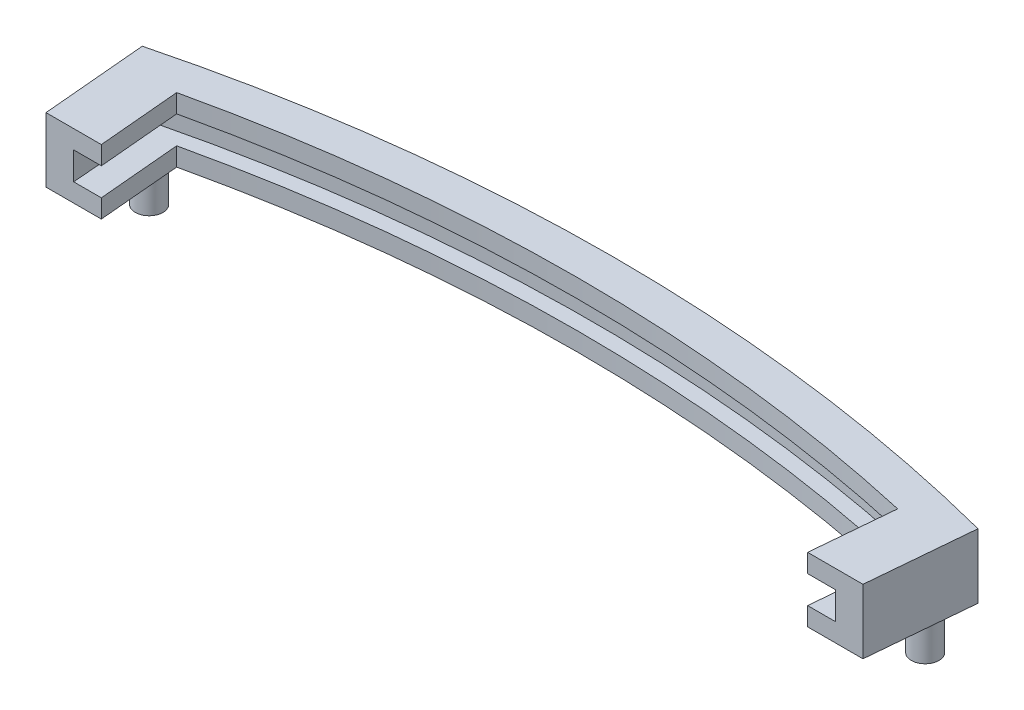
ISO-10303-21;
HEADER;
FILE_DESCRIPTION(('STEP AP214'),'2;1');
FILE_NAME('part.step','',(''),(''),'','','');
FILE_SCHEMA(('AUTOMOTIVE_DESIGN { 1 0 10303 214 1 1 1 1 }'));
ENDSEC;
DATA;
#1=APPLICATION_CONTEXT('core data for automotive mechanical design processes');
#2=APPLICATION_PROTOCOL_DEFINITION('international standard','automotive_design',2000,#1);
#3=PRODUCT_CONTEXT('',#1,'mechanical');
#4=PRODUCT('Part','Part','',(#3));
#5=PRODUCT_RELATED_PRODUCT_CATEGORY('part','',(#4));
#6=PRODUCT_DEFINITION_FORMATION('','',#4);
#7=PRODUCT_DEFINITION_CONTEXT('part definition',#1,'design');
#8=PRODUCT_DEFINITION('design','',#6,#7);
#9=PRODUCT_DEFINITION_SHAPE('','',#8);
#10=(LENGTH_UNIT() NAMED_UNIT(*) SI_UNIT(.MILLI.,.METRE.));
#11=(NAMED_UNIT(*) PLANE_ANGLE_UNIT() SI_UNIT($,.RADIAN.));
#12=(NAMED_UNIT(*) SI_UNIT($,.STERADIAN.) SOLID_ANGLE_UNIT());
#13=UNCERTAINTY_MEASURE_WITH_UNIT(LENGTH_MEASURE(1.E-05),#10,'distance_accuracy_value','');
#14=(GEOMETRIC_REPRESENTATION_CONTEXT(3) GLOBAL_UNCERTAINTY_ASSIGNED_CONTEXT((#13)) GLOBAL_UNIT_ASSIGNED_CONTEXT((#10,
#11,#12)) REPRESENTATION_CONTEXT('',''));
#15=CARTESIAN_POINT('',(0.,0.,0.));
#16=DIRECTION('',(0.,0.,1.));
#17=DIRECTION('',(1.,0.,0.));
#18=AXIS2_PLACEMENT_3D('',#15,#16,#17);
#19=CARTESIAN_POINT('',(0.,0.,0.));
#20=DIRECTION('',(0.,1.,0.));
#21=DIRECTION('',(0.,0.,1.));
#22=AXIS2_PLACEMENT_3D('',#19,#20,#21);
#23=PLANE('',#22);
#24=CARTESIAN_POINT('',(42.0723413631206,0.,-172.963740324371));
#25=DIRECTION('',(0.,1.,0.));
#26=DIRECTION('',(0.,0.,1.));
#27=AXIS2_PLACEMENT_3D('',#24,#25,#26);
#28=CIRCLE('',#27,1.5);
#29=CARTESIAN_POINT('',(42.0723413631206,0.,-171.463740324371));
#30=VERTEX_POINT('',#29);
#31=EDGE_CURVE('E557',#30,#30,#28,.T.);
#32=ORIENTED_EDGE('',*,*,#31,.T.);
#33=EDGE_LOOP('',(#32));
#34=FACE_BOUND('',#33,.T.);
#35=DIRECTION('',(0.0885466075362224,0.,-0.996072034691179));
#36=VECTOR('',#35,1.);
#37=CARTESIAN_POINT('',(38.2925339246378,0.,-163.99909201215));
#38=LINE('',#37,#36);
#39=CARTESIAN_POINT('',(38.2925339246378,0.,-163.99909201215));
#40=VERTEX_POINT('',#39);
#41=CARTESIAN_POINT('',(39.0894533924638,0.,-172.963740324371));
#42=VERTEX_POINT('',#41);
#43=EDGE_CURVE('E275',#40,#42,#38,.T.);
#44=ORIENTED_EDGE('',*,*,#43,.T.);
#45=CARTESIAN_POINT('',(0.,0.,0.));
#46=DIRECTION('',(0.,1.,0.));
#47=DIRECTION('',(0.,0.,1.));
#48=AXIS2_PLACEMENT_3D('',#45,#46,#47);
#49=CIRCLE('',#48,177.325804195323);
#50=CARTESIAN_POINT('',(-39.0894533924644,0.,-172.963740324371));
#51=VERTEX_POINT('',#50);
#52=EDGE_CURVE('E298',#42,#51,#49,.T.);
#53=ORIENTED_EDGE('',*,*,#52,.T.);
#54=DIRECTION('',(-0.0885466075362231,0.,-0.996072034691179));
#55=VECTOR('',#54,1.);
#56=CARTESIAN_POINT('',(-38.2925339246385,0.,-163.99909201215));
#57=LINE('',#56,#55);
#58=CARTESIAN_POINT('',(-38.2925339246385,0.,-163.99909201215));
#59=VERTEX_POINT('',#58);
#60=EDGE_CURVE('E302',#59,#51,#57,.T.);
#61=ORIENTED_EDGE('',*,*,#60,.F.);
#62=DIRECTION('',(1.,0.,0.));
#63=VECTOR('',#62,1.);
#64=CARTESIAN_POINT('',(-44.2925339246385,0.,-163.99909201215));
#65=LINE('',#64,#63);
#66=CARTESIAN_POINT('',(-44.2925339246385,0.,-163.99909201215));
#67=VERTEX_POINT('',#66);
#68=EDGE_CURVE('E306',#67,#59,#65,.T.);
#69=ORIENTED_EDGE('',*,*,#68,.F.);
#70=DIRECTION('',(-0.0885466075362229,0.,-0.996072034691179));
#71=VECTOR('',#70,1.);
#72=CARTESIAN_POINT('',(-44.2925339246385,0.,-163.99909201215));
#73=LINE('',#72,#71);
#74=CARTESIAN_POINT('',(-45.310819911305,0.,-175.453920411099));
#75=VERTEX_POINT('',#74);
#76=EDGE_CURVE('E164',#67,#75,#73,.T.);
#77=ORIENTED_EDGE('',*,*,#76,.T.);
#78=CARTESIAN_POINT('',(0.,0.,0.));
#79=DIRECTION('',(0.,1.,0.));
#80=DIRECTION('',(0.,0.,1.));
#81=AXIS2_PLACEMENT_3D('',#78,#79,#80);
#82=CIRCLE('',#81,181.21023312346);
#83=CARTESIAN_POINT('',(45.3108199113043,0.,-175.453920411099));
#84=VERTEX_POINT('',#83);
#85=EDGE_CURVE('E311',#84,#75,#82,.T.);
#86=ORIENTED_EDGE('',*,*,#85,.F.);
#87=DIRECTION('',(0.0885466075362233,0.,-0.996072034691179));
#88=VECTOR('',#87,1.);
#89=CARTESIAN_POINT('',(44.2925339246378,0.,-163.99909201215));
#90=LINE('',#89,#88);
#91=CARTESIAN_POINT('',(44.2925339246378,0.,-163.99909201215));
#92=VERTEX_POINT('',#91);
#93=EDGE_CURVE('E315',#92,#84,#90,.T.);
#94=ORIENTED_EDGE('',*,*,#93,.F.);
#95=DIRECTION('',(1.,0.,0.));
#96=VECTOR('',#95,1.);
#97=CARTESIAN_POINT('',(38.2925339246378,0.,-163.99909201215));
#98=LINE('',#97,#96);
#99=EDGE_CURVE('E281',#40,#92,#98,.T.);
#100=ORIENTED_EDGE('',*,*,#99,.F.);
#101=EDGE_LOOP('',(#44,#53,#61,#69,#77,#86,#94,#100));
#102=FACE_BOUND('',#101,.T.);
#103=CARTESIAN_POINT('',(-42.0723413631214,0.,-172.963740324371));
#104=DIRECTION('',(0.,1.,0.));
#105=DIRECTION('',(0.,0.,1.));
#106=AXIS2_PLACEMENT_3D('',#103,#104,#105);
#107=CIRCLE('',#106,1.5);
#108=CARTESIAN_POINT('',(-42.0723413631214,0.,-171.463740324371));
#109=VERTEX_POINT('',#108);
#110=EDGE_CURVE('E11',#109,#109,#107,.F.);
#111=ORIENTED_EDGE('',*,*,#110,.F.);
#112=EDGE_LOOP('',(#111));
#113=FACE_BOUND('',#112,.T.);
#114=ADVANCED_FACE('F45',(#34,#102,#113),#23,.F.);
#115=CARTESIAN_POINT('',(38.2925339246378,2.,-163.99909201215));
#116=DIRECTION('',(-0.99607203469118,0.,-0.0885466075362224));
#117=DIRECTION('',(-0.0885466075362224,0.,0.99607203469118));
#118=AXIS2_PLACEMENT_3D('',#115,#116,#117);
#119=PLANE('',#118);
#120=ORIENTED_EDGE('',*,*,#43,.F.);
#121=DIRECTION('',(0.,-1.,0.));
#122=VECTOR('',#121,1.);
#123=CARTESIAN_POINT('',(38.2925339246378,2.,-163.99909201215));
#124=LINE('',#123,#122);
#125=CARTESIAN_POINT('',(38.2925339246378,2.,-163.99909201215));
#126=VERTEX_POINT('',#125);
#127=EDGE_CURVE('E54',#126,#40,#124,.T.);
#128=ORIENTED_EDGE('',*,*,#127,.F.);
#129=DIRECTION('',(0.0885466075362224,0.,-0.996072034691179));
#130=VECTOR('',#129,1.);
#131=CARTESIAN_POINT('',(38.2925339246378,2.,-163.99909201215));
#132=LINE('',#131,#130);
#133=CARTESIAN_POINT('',(39.0894533924638,2.,-172.963740324371));
#134=VERTEX_POINT('',#133);
#135=EDGE_CURVE('E276',#126,#134,#132,.T.);
#136=ORIENTED_EDGE('',*,*,#135,.T.);
#137=DIRECTION('',(0.,-1.,0.));
#138=VECTOR('',#137,1.);
#139=CARTESIAN_POINT('',(39.0894533924638,2.,-172.963740324371));
#140=LINE('',#139,#138);
#141=EDGE_CURVE('E294',#134,#42,#140,.T.);
#142=ORIENTED_EDGE('',*,*,#141,.T.);
#143=EDGE_LOOP('',(#120,#128,#136,#142));
#144=FACE_BOUND('',#143,.T.);
#145=ADVANCED_FACE('F47',(#144),#119,.T.);
#146=CARTESIAN_POINT('',(38.2925339246378,2.,-163.99909201215));
#147=DIRECTION('',(0.,0.,-1.));
#148=DIRECTION('',(-1.,0.,0.));
#149=AXIS2_PLACEMENT_3D('',#146,#147,#148);
#150=PLANE('',#149);
#151=ORIENTED_EDGE('',*,*,#99,.T.);
#152=DIRECTION('',(0.,-1.,0.));
#153=VECTOR('',#152,1.);
#154=CARTESIAN_POINT('',(44.2925339246378,2.,-163.99909201215));
#155=LINE('',#154,#153);
#156=CARTESIAN_POINT('',(44.2925339246378,7.,-163.99909201215));
#157=VERTEX_POINT('',#156);
#158=EDGE_CURVE('E322',#157,#92,#155,.T.);
#159=ORIENTED_EDGE('',*,*,#158,.F.);
#160=DIRECTION('',(1.,0.,0.));
#161=VECTOR('',#160,1.);
#162=CARTESIAN_POINT('',(38.2925339246378,7.,-163.99909201215));
#163=LINE('',#162,#161);
#164=CARTESIAN_POINT('',(38.2925339246378,7.,-163.99909201215));
#165=VERTEX_POINT('',#164);
#166=EDGE_CURVE('E205',#165,#157,#163,.T.);
#167=ORIENTED_EDGE('',*,*,#166,.F.);
#168=DIRECTION('',(0.,-1.,0.));
#169=VECTOR('',#168,1.);
#170=CARTESIAN_POINT('',(38.2925339246378,7.,-163.99909201215));
#171=LINE('',#170,#169);
#172=CARTESIAN_POINT('',(38.2925339246378,5.,-163.99909201215));
#173=VERTEX_POINT('',#172);
#174=EDGE_CURVE('E214',#165,#173,#171,.T.);
#175=ORIENTED_EDGE('',*,*,#174,.T.);
#176=DIRECTION('',(1.,0.,0.));
#177=VECTOR('',#176,1.);
#178=CARTESIAN_POINT('',(38.2925339246378,5.,-163.99909201215));
#179=LINE('',#178,#177);
#180=CARTESIAN_POINT('',(41.2925339246378,5.,-163.99909201215));
#181=VERTEX_POINT('',#180);
#182=EDGE_CURVE('E187',#173,#181,#179,.T.);
#183=ORIENTED_EDGE('',*,*,#182,.T.);
#184=DIRECTION('',(0.,-1.,0.));
#185=VECTOR('',#184,1.);
#186=CARTESIAN_POINT('',(41.2925339246378,5.,-163.99909201215));
#187=LINE('',#186,#185);
#188=CARTESIAN_POINT('',(41.2925339246378,2.,-163.99909201215));
#189=VERTEX_POINT('',#188);
#190=EDGE_CURVE('E252',#181,#189,#187,.T.);
#191=ORIENTED_EDGE('',*,*,#190,.T.);
#192=DIRECTION('',(1.,0.,0.));
#193=VECTOR('',#192,1.);
#194=CARTESIAN_POINT('',(38.2925339246378,2.,-163.99909201215));
#195=LINE('',#194,#193);
#196=EDGE_CURVE('E291',#126,#189,#195,.T.);
#197=ORIENTED_EDGE('',*,*,#196,.F.);
#198=ORIENTED_EDGE('',*,*,#127,.T.);
#199=EDGE_LOOP('',(#151,#159,#167,#175,#183,#191,#197,#198));
#200=FACE_BOUND('',#199,.T.);
#201=ADVANCED_FACE('F353',(#200),#150,.F.);
#202=CARTESIAN_POINT('',(44.2925339246378,2.,-163.99909201215));
#203=DIRECTION('',(-0.996072034691179,0.,-0.0885466075362233));
#204=DIRECTION('',(-0.0885466075362233,0.,0.996072034691179));
#205=AXIS2_PLACEMENT_3D('',#202,#203,#204);
#206=PLANE('',#205);
#207=ORIENTED_EDGE('',*,*,#93,.T.);
#208=DIRECTION('',(0.,-1.,0.));
#209=VECTOR('',#208,1.);
#210=CARTESIAN_POINT('',(45.3108199113043,2.,-175.453920411099));
#211=LINE('',#210,#209);
#212=CARTESIAN_POINT('',(45.3108199113043,7.,-175.453920411099));
#213=VERTEX_POINT('',#212);
#214=EDGE_CURVE('E326',#213,#84,#211,.T.);
#215=ORIENTED_EDGE('',*,*,#214,.F.);
#216=DIRECTION('',(0.0885466075362233,0.,-0.996072034691179));
#217=VECTOR('',#216,1.);
#218=CARTESIAN_POINT('',(44.2925339246378,7.,-163.99909201215));
#219=LINE('',#218,#217);
#220=EDGE_CURVE('E209',#157,#213,#219,.T.);
#221=ORIENTED_EDGE('',*,*,#220,.F.);
#222=ORIENTED_EDGE('',*,*,#158,.T.);
#223=EDGE_LOOP('',(#207,#215,#221,#222));
#224=FACE_BOUND('',#223,.T.);
#225=ADVANCED_FACE('F358',(#224),#206,.F.);
#226=CARTESIAN_POINT('',(0.,2.,0.));
#227=DIRECTION('',(0.,-1.,0.));
#228=DIRECTION('',(0.,0.,-1.));
#229=AXIS2_PLACEMENT_3D('',#226,#227,#228);
#230=CYLINDRICAL_SURFACE('',#229,181.21023312346);
#231=ORIENTED_EDGE('',*,*,#85,.T.);
#232=DIRECTION('',(0.,-1.,0.));
#233=VECTOR('',#232,1.);
#234=CARTESIAN_POINT('',(-45.310819911305,2.,-175.453920411099));
#235=LINE('',#234,#233);
#236=CARTESIAN_POINT('',(-45.3108199113049,7.,-175.453920411098));
#237=VERTEX_POINT('',#236);
#238=EDGE_CURVE('E168',#237,#75,#235,.T.);
#239=ORIENTED_EDGE('',*,*,#238,.F.);
#240=CARTESIAN_POINT('',(0.,7.,0.));
#241=DIRECTION('',(0.,1.,0.));
#242=DIRECTION('',(0.,0.,1.));
#243=AXIS2_PLACEMENT_3D('',#240,#241,#242);
#244=CIRCLE('',#243,181.21023312346);
#245=EDGE_CURVE('E185',#213,#237,#244,.T.);
#246=ORIENTED_EDGE('',*,*,#245,.F.);
#247=ORIENTED_EDGE('',*,*,#214,.T.);
#248=EDGE_LOOP('',(#231,#239,#246,#247));
#249=FACE_BOUND('',#248,.T.);
#250=ADVANCED_FACE('F360',(#249),#230,.T.);
#251=CARTESIAN_POINT('',(-44.2925339246385,2.,-163.99909201215));
#252=DIRECTION('',(-0.996072034691179,0.,0.0885466075362229));
#253=DIRECTION('',(0.0885466075362229,0.,0.99607203469118));
#254=AXIS2_PLACEMENT_3D('',#251,#252,#253);
#255=PLANE('',#254);
#256=ORIENTED_EDGE('',*,*,#76,.F.);
#257=DIRECTION('',(0.,-1.,0.));
#258=VECTOR('',#257,1.);
#259=CARTESIAN_POINT('',(-44.2925339246385,2.,-163.99909201215));
#260=LINE('',#259,#258);
#261=CARTESIAN_POINT('',(-44.2925339246385,7.,-163.99909201215));
#262=VERTEX_POINT('',#261);
#263=EDGE_CURVE('E158',#262,#67,#260,.T.);
#264=ORIENTED_EDGE('',*,*,#263,.F.);
#265=DIRECTION('',(0.088546607536219,0.,0.99607203469118));
#266=VECTOR('',#265,1.);
#267=CARTESIAN_POINT('',(-44.2925339246385,7.,-163.99909201215));
#268=LINE('',#267,#266);
#269=EDGE_CURVE('E162',#237,#262,#268,.T.);
#270=ORIENTED_EDGE('',*,*,#269,.F.);
#271=ORIENTED_EDGE('',*,*,#238,.T.);
#272=EDGE_LOOP('',(#256,#264,#270,#271));
#273=FACE_BOUND('',#272,.T.);
#274=ADVANCED_FACE('F160',(#273),#255,.T.);
#275=CARTESIAN_POINT('',(-44.2925339246385,2.,-163.99909201215));
#276=DIRECTION('',(0.,0.,-1.));
#277=DIRECTION('',(-1.,0.,0.));
#278=AXIS2_PLACEMENT_3D('',#275,#276,#277);
#279=PLANE('',#278);
#280=ORIENTED_EDGE('',*,*,#68,.T.);
#281=DIRECTION('',(0.,-1.,0.));
#282=VECTOR('',#281,1.);
#283=CARTESIAN_POINT('',(-38.2925339246385,2.,-163.99909201215));
#284=LINE('',#283,#282);
#285=CARTESIAN_POINT('',(-38.2925339246385,2.,-163.99909201215));
#286=VERTEX_POINT('',#285);
#287=EDGE_CURVE('E169',#286,#59,#284,.T.);
#288=ORIENTED_EDGE('',*,*,#287,.F.);
#289=DIRECTION('',(1.,0.,0.));
#290=VECTOR('',#289,1.);
#291=CARTESIAN_POINT('',(-44.2925339246385,2.,-163.99909201215));
#292=LINE('',#291,#290);
#293=CARTESIAN_POINT('',(-41.2925339246385,2.,-163.99909201215));
#294=VERTEX_POINT('',#293);
#295=EDGE_CURVE('E288',#294,#286,#292,.T.);
#296=ORIENTED_EDGE('',*,*,#295,.F.);
#297=DIRECTION('',(0.,-1.,0.));
#298=VECTOR('',#297,1.);
#299=CARTESIAN_POINT('',(-41.2925339246385,5.,-163.99909201215));
#300=LINE('',#299,#298);
#301=CARTESIAN_POINT('',(-41.2925339246385,5.,-163.99909201215));
#302=VERTEX_POINT('',#301);
#303=EDGE_CURVE('E271',#302,#294,#300,.T.);
#304=ORIENTED_EDGE('',*,*,#303,.F.);
#305=DIRECTION('',(1.,0.,0.));
#306=VECTOR('',#305,1.);
#307=CARTESIAN_POINT('',(-44.2925339246385,5.,-163.99909201215));
#308=LINE('',#307,#306);
#309=CARTESIAN_POINT('',(-38.2925339246385,5.,-163.99909201215));
#310=VERTEX_POINT('',#309);
#311=EDGE_CURVE('E215',#302,#310,#308,.T.);
#312=ORIENTED_EDGE('',*,*,#311,.T.);
#313=DIRECTION('',(0.,-1.,0.));
#314=VECTOR('',#313,1.);
#315=CARTESIAN_POINT('',(-38.2925339246385,7.,-163.99909201215));
#316=LINE('',#315,#314);
#317=CARTESIAN_POINT('',(-38.2925339246385,7.,-163.99909201215));
#318=VERTEX_POINT('',#317);
#319=EDGE_CURVE('E175',#318,#310,#316,.T.);
#320=ORIENTED_EDGE('',*,*,#319,.F.);
#321=DIRECTION('',(1.,0.,0.));
#322=VECTOR('',#321,1.);
#323=CARTESIAN_POINT('',(-44.2925339246385,7.,-163.99909201215));
#324=LINE('',#323,#322);
#325=EDGE_CURVE('E172',#262,#318,#324,.T.);
#326=ORIENTED_EDGE('',*,*,#325,.F.);
#327=ORIENTED_EDGE('',*,*,#263,.T.);
#328=EDGE_LOOP('',(#280,#288,#296,#304,#312,#320,#326,#327));
#329=FACE_BOUND('',#328,.T.);
#330=ADVANCED_FACE('F173',(#329),#279,.F.);
#331=CARTESIAN_POINT('',(-38.2925339246385,2.,-163.99909201215));
#332=DIRECTION('',(-0.996072034691179,0.,0.0885466075362231));
#333=DIRECTION('',(0.0885466075362232,0.,0.99607203469118));
#334=AXIS2_PLACEMENT_3D('',#331,#332,#333);
#335=PLANE('',#334);
#336=ORIENTED_EDGE('',*,*,#60,.T.);
#337=DIRECTION('',(0.,-1.,0.));
#338=VECTOR('',#337,1.);
#339=CARTESIAN_POINT('',(-39.0894533924644,2.,-172.963740324371));
#340=LINE('',#339,#338);
#341=CARTESIAN_POINT('',(-39.0894533924644,2.,-172.963740324371));
#342=VERTEX_POINT('',#341);
#343=EDGE_CURVE('E335',#342,#51,#340,.T.);
#344=ORIENTED_EDGE('',*,*,#343,.F.);
#345=DIRECTION('',(-0.0885466075362231,0.,-0.996072034691179));
#346=VECTOR('',#345,1.);
#347=CARTESIAN_POINT('',(-38.2925339246385,2.,-163.99909201215));
#348=LINE('',#347,#346);
#349=EDGE_CURVE('E285',#286,#342,#348,.T.);
#350=ORIENTED_EDGE('',*,*,#349,.F.);
#351=ORIENTED_EDGE('',*,*,#287,.T.);
#352=EDGE_LOOP('',(#336,#344,#350,#351));
#353=FACE_BOUND('',#352,.T.);
#354=ADVANCED_FACE('F364',(#353),#335,.F.);
#355=CARTESIAN_POINT('',(0.,2.,0.));
#356=DIRECTION('',(0.,-1.,0.));
#357=DIRECTION('',(0.,0.,-1.));
#358=AXIS2_PLACEMENT_3D('',#355,#356,#357);
#359=CYLINDRICAL_SURFACE('',#358,177.325804195323);
#360=ORIENTED_EDGE('',*,*,#52,.F.);
#361=ORIENTED_EDGE('',*,*,#141,.F.);
#362=CARTESIAN_POINT('',(0.,2.,0.));
#363=DIRECTION('',(0.,1.,0.));
#364=DIRECTION('',(0.,0.,1.));
#365=AXIS2_PLACEMENT_3D('',#362,#363,#364);
#366=CIRCLE('',#365,177.325804195323);
#367=EDGE_CURVE('E280',#134,#342,#366,.T.);
#368=ORIENTED_EDGE('',*,*,#367,.T.);
#369=ORIENTED_EDGE('',*,*,#343,.T.);
#370=EDGE_LOOP('',(#360,#361,#368,#369));
#371=FACE_BOUND('',#370,.T.);
#372=ADVANCED_FACE('F344',(#371),#359,.F.);
#373=CARTESIAN_POINT('',(0.,2.,0.));
#374=DIRECTION('',(0.,1.,0.));
#375=DIRECTION('',(0.,0.,1.));
#376=AXIS2_PLACEMENT_3D('',#373,#374,#375);
#377=PLANE('',#376);
#378=DIRECTION('',(-0.0885466075362226,0.,0.996072034691179));
#379=VECTOR('',#378,1.);
#380=CARTESIAN_POINT('',(41.2925339246378,2.,-163.99909201215));
#381=LINE('',#380,#379);
#382=CARTESIAN_POINT('',(42.178,2.,-173.959812359062));
#383=VERTEX_POINT('',#382);
#384=EDGE_CURVE('E61',#383,#189,#381,.T.);
#385=ORIENTED_EDGE('',*,*,#384,.F.);
#386=CARTESIAN_POINT('',(0.,2.,0.));
#387=DIRECTION('',(0.,-1.,0.));
#388=DIRECTION('',(0.,0.,1.));
#389=AXIS2_PLACEMENT_3D('',#386,#387,#388);
#390=CIRCLE('',#389,179.);
#391=CARTESIAN_POINT('',(-42.1027354556342,2.,-173.978043635261));
#392=VERTEX_POINT('',#391);
#393=EDGE_CURVE('E255',#392,#383,#390,.T.);
#394=ORIENTED_EDGE('',*,*,#393,.F.);
#395=DIRECTION('',(-0.080924757758321,0.,-0.996720213290448));
#396=VECTOR('',#395,1.);
#397=CARTESIAN_POINT('',(-41.2925339246385,2.,-163.99909201215));
#398=LINE('',#397,#396);
#399=EDGE_CURVE('E67',#294,#392,#398,.T.);
#400=ORIENTED_EDGE('',*,*,#399,.F.);
#401=ORIENTED_EDGE('',*,*,#295,.T.);
#402=ORIENTED_EDGE('',*,*,#349,.T.);
#403=ORIENTED_EDGE('',*,*,#367,.F.);
#404=ORIENTED_EDGE('',*,*,#135,.F.);
#405=ORIENTED_EDGE('',*,*,#196,.T.);
#406=EDGE_LOOP('',(#385,#394,#400,#401,#402,#403,#404,#405));
#407=FACE_BOUND('',#406,.T.);
#408=ADVANCED_FACE('F365',(#407),#377,.T.);
#409=CARTESIAN_POINT('',(-41.2925339246385,5.,-163.99909201215));
#410=DIRECTION('',(-0.996720213290448,0.,0.0809247577583211));
#411=DIRECTION('',(0.0809247577583211,0.,0.996720213290448));
#412=AXIS2_PLACEMENT_3D('',#409,#410,#411);
#413=PLANE('',#412);
#414=ORIENTED_EDGE('',*,*,#399,.T.);
#415=DIRECTION('',(0.,-1.,0.));
#416=VECTOR('',#415,1.);
#417=CARTESIAN_POINT('',(-42.1027354556342,5.,-173.978043635261));
#418=LINE('',#417,#416);
#419=CARTESIAN_POINT('',(-42.1027354556342,5.,-173.978043635261));
#420=VERTEX_POINT('',#419);
#421=EDGE_CURVE('E267',#420,#392,#418,.T.);
#422=ORIENTED_EDGE('',*,*,#421,.F.);
#423=DIRECTION('',(-0.080924757758321,0.,-0.996720213290448));
#424=VECTOR('',#423,1.);
#425=CARTESIAN_POINT('',(-41.2925339246385,5.,-163.99909201215));
#426=LINE('',#425,#424);
#427=EDGE_CURVE('E240',#302,#420,#426,.T.);
#428=ORIENTED_EDGE('',*,*,#427,.F.);
#429=ORIENTED_EDGE('',*,*,#303,.T.);
#430=EDGE_LOOP('',(#414,#422,#428,#429));
#431=FACE_BOUND('',#430,.T.);
#432=ADVANCED_FACE('F369',(#431),#413,.F.);
#433=CARTESIAN_POINT('',(0.,5.,0.));
#434=DIRECTION('',(0.,-1.,0.));
#435=DIRECTION('',(0.,0.,-1.));
#436=AXIS2_PLACEMENT_3D('',#433,#434,#435);
#437=CYLINDRICAL_SURFACE('',#436,179.);
#438=ORIENTED_EDGE('',*,*,#393,.T.);
#439=DIRECTION('',(0.,-1.,0.));
#440=VECTOR('',#439,1.);
#441=CARTESIAN_POINT('',(42.178,5.,-173.959812359062));
#442=LINE('',#441,#440);
#443=CARTESIAN_POINT('',(42.178,5.,-173.959812359062));
#444=VERTEX_POINT('',#443);
#445=EDGE_CURVE('E263',#444,#383,#442,.T.);
#446=ORIENTED_EDGE('',*,*,#445,.F.);
#447=CARTESIAN_POINT('',(0.,5.,0.));
#448=DIRECTION('',(0.,-1.,0.));
#449=DIRECTION('',(0.,0.,1.));
#450=AXIS2_PLACEMENT_3D('',#447,#448,#449);
#451=CIRCLE('',#450,179.);
#452=EDGE_CURVE('E244',#420,#444,#451,.T.);
#453=ORIENTED_EDGE('',*,*,#452,.F.);
#454=ORIENTED_EDGE('',*,*,#421,.T.);
#455=EDGE_LOOP('',(#438,#446,#453,#454));
#456=FACE_BOUND('',#455,.T.);
#457=ADVANCED_FACE('F392',(#456),#437,.F.);
#458=CARTESIAN_POINT('',(41.2925339246378,5.,-163.99909201215));
#459=DIRECTION('',(0.996072034691179,0.,0.0885466075362226));
#460=DIRECTION('',(0.0885466075362226,0.,-0.996072034691179));
#461=AXIS2_PLACEMENT_3D('',#458,#459,#460);
#462=PLANE('',#461);
#463=ORIENTED_EDGE('',*,*,#384,.T.);
#464=ORIENTED_EDGE('',*,*,#190,.F.);
#465=DIRECTION('',(-0.0885466075362226,0.,0.996072034691179));
#466=VECTOR('',#465,1.);
#467=CARTESIAN_POINT('',(41.2925339246378,5.,-163.99909201215));
#468=LINE('',#467,#466);
#469=EDGE_CURVE('E248',#444,#181,#468,.T.);
#470=ORIENTED_EDGE('',*,*,#469,.F.);
#471=ORIENTED_EDGE('',*,*,#445,.T.);
#472=EDGE_LOOP('',(#463,#464,#470,#471));
#473=FACE_BOUND('',#472,.T.);
#474=ADVANCED_FACE('F390',(#473),#462,.F.);
#475=CARTESIAN_POINT('',(0.,5.,0.));
#476=DIRECTION('',(0.,1.,0.));
#477=DIRECTION('',(0.,0.,1.));
#478=AXIS2_PLACEMENT_3D('',#475,#476,#477);
#479=PLANE('',#478);
#480=ORIENTED_EDGE('',*,*,#311,.F.);
#481=ORIENTED_EDGE('',*,*,#427,.T.);
#482=ORIENTED_EDGE('',*,*,#452,.T.);
#483=ORIENTED_EDGE('',*,*,#469,.T.);
#484=ORIENTED_EDGE('',*,*,#182,.F.);
#485=DIRECTION('',(-0.0885466075362224,0.,0.996072034691179));
#486=VECTOR('',#485,1.);
#487=CARTESIAN_POINT('',(39.0894533924638,5.,-172.963740324371));
#488=LINE('',#487,#486);
#489=CARTESIAN_POINT('',(39.0894533924638,5.,-172.963740324371));
#490=VERTEX_POINT('',#489);
#491=EDGE_CURVE('E191',#490,#173,#488,.T.);
#492=ORIENTED_EDGE('',*,*,#491,.F.);
#493=CARTESIAN_POINT('',(0.,5.,0.));
#494=DIRECTION('',(0.,-1.,0.));
#495=DIRECTION('',(0.,0.,1.));
#496=AXIS2_PLACEMENT_3D('',#493,#494,#495);
#497=CIRCLE('',#496,177.325804195323);
#498=CARTESIAN_POINT('',(-39.0894533924645,5.,-172.963740324371));
#499=VERTEX_POINT('',#498);
#500=EDGE_CURVE('E222',#499,#490,#497,.T.);
#501=ORIENTED_EDGE('',*,*,#500,.F.);
#502=DIRECTION('',(-0.0885466075362231,0.,-0.996072034691179));
#503=VECTOR('',#502,1.);
#504=CARTESIAN_POINT('',(-38.2925339246385,5.,-163.99909201215));
#505=LINE('',#504,#503);
#506=EDGE_CURVE('E218',#310,#499,#505,.T.);
#507=ORIENTED_EDGE('',*,*,#506,.F.);
#508=EDGE_LOOP('',(#480,#481,#482,#483,#484,#492,#501,#507));
#509=FACE_BOUND('',#508,.T.);
#510=ADVANCED_FACE('F372',(#509),#479,.F.);
#511=CARTESIAN_POINT('',(-38.2925339246385,7.,-163.99909201215));
#512=DIRECTION('',(-0.996072034691179,0.,0.0885466075362231));
#513=DIRECTION('',(0.0885466075362232,0.,0.99607203469118));
#514=AXIS2_PLACEMENT_3D('',#511,#512,#513);
#515=PLANE('',#514);
#516=ORIENTED_EDGE('',*,*,#506,.T.);
#517=DIRECTION('',(0.,-1.,0.));
#518=VECTOR('',#517,1.);
#519=CARTESIAN_POINT('',(-39.0894533924645,7.,-172.963740324371));
#520=LINE('',#519,#518);
#521=CARTESIAN_POINT('',(-39.0894533924645,7.,-172.963740324371));
#522=VERTEX_POINT('',#521);
#523=EDGE_CURVE('E234',#522,#499,#520,.T.);
#524=ORIENTED_EDGE('',*,*,#523,.F.);
#525=DIRECTION('',(-0.0885466075362231,0.,-0.996072034691179));
#526=VECTOR('',#525,1.);
#527=CARTESIAN_POINT('',(-38.2925339246385,7.,-163.99909201215));
#528=LINE('',#527,#526);
#529=EDGE_CURVE('E179',#318,#522,#528,.T.);
#530=ORIENTED_EDGE('',*,*,#529,.F.);
#531=ORIENTED_EDGE('',*,*,#319,.T.);
#532=EDGE_LOOP('',(#516,#524,#530,#531));
#533=FACE_BOUND('',#532,.T.);
#534=ADVANCED_FACE('F376',(#533),#515,.F.);
#535=CARTESIAN_POINT('',(0.,7.,0.));
#536=DIRECTION('',(0.,-1.,0.));
#537=DIRECTION('',(0.,0.,-1.));
#538=AXIS2_PLACEMENT_3D('',#535,#536,#537);
#539=CYLINDRICAL_SURFACE('',#538,177.325804195323);
#540=ORIENTED_EDGE('',*,*,#500,.T.);
#541=DIRECTION('',(0.,-1.,0.));
#542=VECTOR('',#541,1.);
#543=CARTESIAN_POINT('',(39.0894533924638,7.,-172.963740324371));
#544=LINE('',#543,#542);
#545=CARTESIAN_POINT('',(39.0894533924638,7.,-172.963740324371));
#546=VERTEX_POINT('',#545);
#547=EDGE_CURVE('E230',#546,#490,#544,.T.);
#548=ORIENTED_EDGE('',*,*,#547,.F.);
#549=CARTESIAN_POINT('',(0.,7.,0.));
#550=DIRECTION('',(0.,-1.,0.));
#551=DIRECTION('',(0.,0.,1.));
#552=AXIS2_PLACEMENT_3D('',#549,#550,#551);
#553=CIRCLE('',#552,177.325804195323);
#554=EDGE_CURVE('E199',#522,#546,#553,.T.);
#555=ORIENTED_EDGE('',*,*,#554,.F.);
#556=ORIENTED_EDGE('',*,*,#523,.T.);
#557=EDGE_LOOP('',(#540,#548,#555,#556));
#558=FACE_BOUND('',#557,.T.);
#559=ADVANCED_FACE('F383',(#558),#539,.F.);
#560=CARTESIAN_POINT('',(39.0894533924638,7.,-172.963740324371));
#561=DIRECTION('',(0.99607203469118,0.,0.0885466075362224));
#562=DIRECTION('',(0.0885466075362224,0.,-0.99607203469118));
#563=AXIS2_PLACEMENT_3D('',#560,#561,#562);
#564=PLANE('',#563);
#565=ORIENTED_EDGE('',*,*,#491,.T.);
#566=ORIENTED_EDGE('',*,*,#174,.F.);
#567=DIRECTION('',(-0.0885466075362224,0.,0.996072034691179));
#568=VECTOR('',#567,1.);
#569=CARTESIAN_POINT('',(39.0894533924638,7.,-172.963740324371));
#570=LINE('',#569,#568);
#571=EDGE_CURVE('E202',#546,#165,#570,.T.);
#572=ORIENTED_EDGE('',*,*,#571,.F.);
#573=ORIENTED_EDGE('',*,*,#547,.T.);
#574=EDGE_LOOP('',(#565,#566,#572,#573));
#575=FACE_BOUND('',#574,.T.);
#576=ADVANCED_FACE('F386',(#575),#564,.F.);
#577=CARTESIAN_POINT('',(0.,7.,0.));
#578=DIRECTION('',(0.,1.,0.));
#579=DIRECTION('',(0.,0.,1.));
#580=AXIS2_PLACEMENT_3D('',#577,#578,#579);
#581=PLANE('',#580);
#582=ORIENTED_EDGE('',*,*,#269,.T.);
#583=ORIENTED_EDGE('',*,*,#325,.T.);
#584=ORIENTED_EDGE('',*,*,#529,.T.);
#585=ORIENTED_EDGE('',*,*,#554,.T.);
#586=ORIENTED_EDGE('',*,*,#571,.T.);
#587=ORIENTED_EDGE('',*,*,#166,.T.);
#588=ORIENTED_EDGE('',*,*,#220,.T.);
#589=ORIENTED_EDGE('',*,*,#245,.T.);
#590=EDGE_LOOP('',(#582,#583,#584,#585,#586,#587,#588,#589));
#591=FACE_BOUND('',#590,.T.);
#592=ADVANCED_FACE('F182',(#591),#581,.T.);
#593=CARTESIAN_POINT('',(42.0723413631206,-5.,-172.963740324371));
#594=DIRECTION('',(0.,1.,0.));
#595=DIRECTION('',(0.,0.,1.));
#596=AXIS2_PLACEMENT_3D('',#593,#594,#595);
#597=CYLINDRICAL_SURFACE('',#596,1.5);
#598=CARTESIAN_POINT('',(42.0723413631206,-5.,-172.963740324371));
#599=DIRECTION('',(0.,1.,0.));
#600=DIRECTION('',(0.,0.,1.));
#601=AXIS2_PLACEMENT_3D('',#598,#599,#600);
#602=CIRCLE('',#601,1.5);
#603=CARTESIAN_POINT('',(42.0723413631206,-5.,-171.463740324371));
#604=VERTEX_POINT('',#603);
#605=EDGE_CURVE('E194',#604,#604,#602,.T.);
#606=ORIENTED_EDGE('',*,*,#605,.T.);
#607=EDGE_LOOP('',(#606));
#608=FACE_BOUND('',#607,.T.);
#609=ORIENTED_EDGE('',*,*,#31,.F.);
#610=EDGE_LOOP('',(#609));
#611=FACE_BOUND('',#610,.T.);
#612=ADVANCED_FACE('F506',(#608,#611),#597,.T.);
#613=CARTESIAN_POINT('',(42.0723413631206,-5.,-172.963740324371));
#614=DIRECTION('',(0.,1.,0.));
#615=DIRECTION('',(0.,0.,1.));
#616=AXIS2_PLACEMENT_3D('',#613,#614,#615);
#617=PLANE('',#616);
#618=ORIENTED_EDGE('',*,*,#605,.F.);
#619=EDGE_LOOP('',(#618));
#620=FACE_BOUND('',#619,.T.);
#621=ADVANCED_FACE('F521',(#620),#617,.F.);
#622=CARTESIAN_POINT('',(-42.0723413631214,-5.,-172.963740324371));
#623=DIRECTION('',(0.,1.,0.));
#624=DIRECTION('',(0.,0.,1.));
#625=AXIS2_PLACEMENT_3D('',#622,#623,#624);
#626=CYLINDRICAL_SURFACE('',#625,1.5);
#627=CARTESIAN_POINT('',(-42.0723413631214,-5.,-172.963740324371));
#628=DIRECTION('',(0.,-1.,0.));
#629=DIRECTION('',(0.,0.,-1.));
#630=AXIS2_PLACEMENT_3D('',#627,#628,#629);
#631=CIRCLE('',#630,1.5);
#632=CARTESIAN_POINT('',(-42.0723413631214,-5.,-174.463740324371));
#633=VERTEX_POINT('',#632);
#634=EDGE_CURVE('E219',#633,#633,#631,.T.);
#635=ORIENTED_EDGE('',*,*,#634,.F.);
#636=EDGE_LOOP('',(#635));
#637=FACE_BOUND('',#636,.T.);
#638=ORIENTED_EDGE('',*,*,#110,.T.);
#639=EDGE_LOOP('',(#638));
#640=FACE_BOUND('',#639,.T.);
#641=ADVANCED_FACE('F531',(#637,#640),#626,.T.);
#642=CARTESIAN_POINT('',(-42.0723413631214,-5.,-172.963740324371));
#643=DIRECTION('',(0.,-1.,0.));
#644=DIRECTION('',(0.,0.,-1.));
#645=AXIS2_PLACEMENT_3D('',#642,#643,#644);
#646=PLANE('',#645);
#647=ORIENTED_EDGE('',*,*,#634,.T.);
#648=EDGE_LOOP('',(#647));
#649=FACE_BOUND('',#648,.T.);
#650=ADVANCED_FACE('F541',(#649),#646,.T.);
#651=CLOSED_SHELL('',(#114,#145,#201,#225,#250,#274,#330,#354,#372,#408,#432,#457,#474,#510,
#534,#559,#576,#592,#612,#621,#641,#650));
#652=MANIFOLD_SOLID_BREP('B2',#651);
#653=ADVANCED_BREP_SHAPE_REPRESENTATION('',(#18,#652),#14);
#654=SHAPE_DEFINITION_REPRESENTATION(#9,#653);
ENDSEC;
END-ISO-10303-21;
